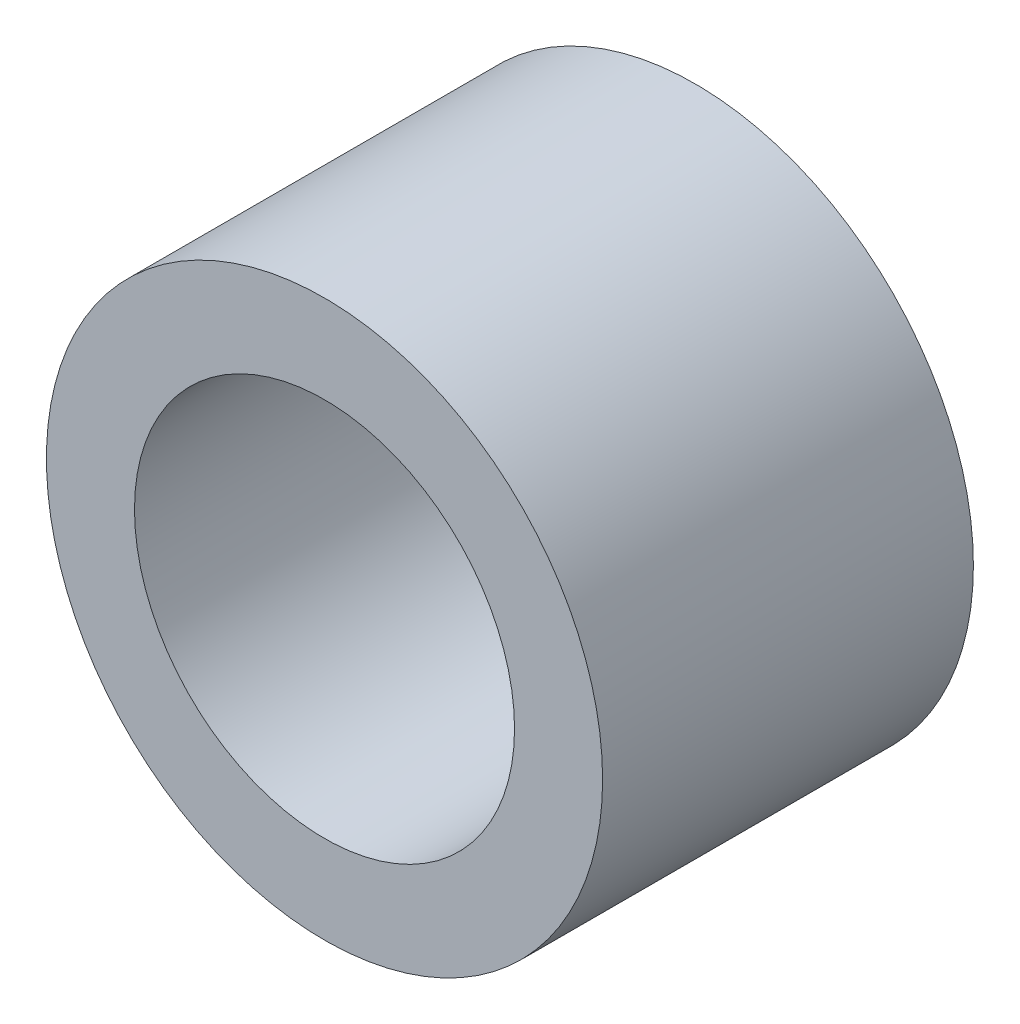
ISO-10303-21;
HEADER;
FILE_DESCRIPTION(('STEP AP214'),'2;1');
FILE_NAME('part.step','',(''),(''),'','','');
FILE_SCHEMA(('AUTOMOTIVE_DESIGN { 1 0 10303 214 1 1 1 1 }'));
ENDSEC;
DATA;
#1=APPLICATION_CONTEXT('core data for automotive mechanical design processes');
#2=APPLICATION_PROTOCOL_DEFINITION('international standard','automotive_design',2000,#1);
#3=PRODUCT_CONTEXT('',#1,'mechanical');
#4=PRODUCT('Part','Part','',(#3));
#5=PRODUCT_RELATED_PRODUCT_CATEGORY('part','',(#4));
#6=PRODUCT_DEFINITION_FORMATION('','',#4);
#7=PRODUCT_DEFINITION_CONTEXT('part definition',#1,'design');
#8=PRODUCT_DEFINITION('design','',#6,#7);
#9=PRODUCT_DEFINITION_SHAPE('','',#8);
#10=(LENGTH_UNIT() NAMED_UNIT(*) SI_UNIT(.MILLI.,.METRE.));
#11=(NAMED_UNIT(*) PLANE_ANGLE_UNIT() SI_UNIT($,.RADIAN.));
#12=(NAMED_UNIT(*) SI_UNIT($,.STERADIAN.) SOLID_ANGLE_UNIT());
#13=UNCERTAINTY_MEASURE_WITH_UNIT(LENGTH_MEASURE(1.E-05),#10,'distance_accuracy_value','');
#14=(GEOMETRIC_REPRESENTATION_CONTEXT(3) GLOBAL_UNCERTAINTY_ASSIGNED_CONTEXT((#13)) GLOBAL_UNIT_ASSIGNED_CONTEXT((#10,
#11,#12)) REPRESENTATION_CONTEXT('',''));
#15=CARTESIAN_POINT('',(0.,0.,0.));
#16=DIRECTION('',(0.,0.,1.));
#17=DIRECTION('',(1.,0.,0.));
#18=AXIS2_PLACEMENT_3D('',#15,#16,#17);
#19=CARTESIAN_POINT('',(0.,0.,8.));
#20=DIRECTION('',(0.,0.,1.));
#21=DIRECTION('',(1.,0.,0.));
#22=AXIS2_PLACEMENT_3D('',#19,#20,#21);
#23=PLANE('',#22);
#24=CARTESIAN_POINT('',(0.,0.,8.));
#25=DIRECTION('',(0.,0.,1.));
#26=DIRECTION('',(1.,0.,0.));
#27=AXIS2_PLACEMENT_3D('',#24,#25,#26);
#28=CIRCLE('',#27,6.);
#29=CARTESIAN_POINT('',(6.,0.,8.));
#30=VERTEX_POINT('',#29);
#31=EDGE_CURVE('E10',#30,#30,#28,.T.);
#32=ORIENTED_EDGE('',*,*,#31,.T.);
#33=EDGE_LOOP('',(#32));
#34=FACE_BOUND('',#33,.T.);
#35=CARTESIAN_POINT('',(0.,0.,8.));
#36=DIRECTION('',(0.,0.,1.));
#37=DIRECTION('',(1.,0.,0.));
#38=AXIS2_PLACEMENT_3D('',#35,#36,#37);
#39=CIRCLE('',#38,4.1);
#40=CARTESIAN_POINT('',(4.1,0.,8.));
#41=VERTEX_POINT('',#40);
#42=EDGE_CURVE('E50',#41,#41,#39,.T.);
#43=ORIENTED_EDGE('',*,*,#42,.F.);
#44=EDGE_LOOP('',(#43));
#45=FACE_BOUND('',#44,.T.);
#46=ADVANCED_FACE('F39',(#34,#45),#23,.T.);
#47=CARTESIAN_POINT('',(0.,0.,0.));
#48=DIRECTION('',(0.,0.,1.));
#49=DIRECTION('',(1.,0.,0.));
#50=AXIS2_PLACEMENT_3D('',#47,#48,#49);
#51=PLANE('',#50);
#52=CARTESIAN_POINT('',(0.,0.,0.));
#53=DIRECTION('',(0.,0.,1.));
#54=DIRECTION('',(1.,0.,0.));
#55=AXIS2_PLACEMENT_3D('',#52,#53,#54);
#56=CIRCLE('',#55,6.);
#57=CARTESIAN_POINT('',(6.,0.,0.));
#58=VERTEX_POINT('',#57);
#59=EDGE_CURVE('E43',#58,#58,#56,.T.);
#60=ORIENTED_EDGE('',*,*,#59,.F.);
#61=EDGE_LOOP('',(#60));
#62=FACE_BOUND('',#61,.T.);
#63=CARTESIAN_POINT('',(0.,0.,0.));
#64=DIRECTION('',(0.,0.,1.));
#65=DIRECTION('',(1.,0.,0.));
#66=AXIS2_PLACEMENT_3D('',#63,#64,#65);
#67=CIRCLE('',#66,4.1);
#68=CARTESIAN_POINT('',(4.1,0.,0.));
#69=VERTEX_POINT('',#68);
#70=EDGE_CURVE('E52',#69,#69,#67,.T.);
#71=ORIENTED_EDGE('',*,*,#70,.T.);
#72=EDGE_LOOP('',(#71));
#73=FACE_BOUND('',#72,.T.);
#74=ADVANCED_FACE('F62',(#62,#73),#51,.F.);
#75=CARTESIAN_POINT('',(0.,0.,8.));
#76=DIRECTION('',(0.,0.,-1.));
#77=DIRECTION('',(-1.,0.,0.));
#78=AXIS2_PLACEMENT_3D('',#75,#76,#77);
#79=CYLINDRICAL_SURFACE('',#78,6.);
#80=ORIENTED_EDGE('',*,*,#31,.F.);
#81=EDGE_LOOP('',(#80));
#82=FACE_BOUND('',#81,.T.);
#83=ORIENTED_EDGE('',*,*,#59,.T.);
#84=EDGE_LOOP('',(#83));
#85=FACE_BOUND('',#84,.T.);
#86=ADVANCED_FACE('F41',(#82,#85),#79,.T.);
#87=CARTESIAN_POINT('',(0.,0.,8.));
#88=DIRECTION('',(0.,0.,-1.));
#89=DIRECTION('',(-1.,0.,0.));
#90=AXIS2_PLACEMENT_3D('',#87,#88,#89);
#91=CYLINDRICAL_SURFACE('',#90,4.1);
#92=ORIENTED_EDGE('',*,*,#42,.T.);
#93=EDGE_LOOP('',(#92));
#94=FACE_BOUND('',#93,.T.);
#95=ORIENTED_EDGE('',*,*,#70,.F.);
#96=EDGE_LOOP('',(#95));
#97=FACE_BOUND('',#96,.T.);
#98=ADVANCED_FACE('F58',(#94,#97),#91,.F.);
#99=CLOSED_SHELL('',(#46,#74,#86,#98));
#100=MANIFOLD_SOLID_BREP('B2',#99);
#101=ADVANCED_BREP_SHAPE_REPRESENTATION('',(#18,#100),#14);
#102=SHAPE_DEFINITION_REPRESENTATION(#9,#101);
ENDSEC;
END-ISO-10303-21;
